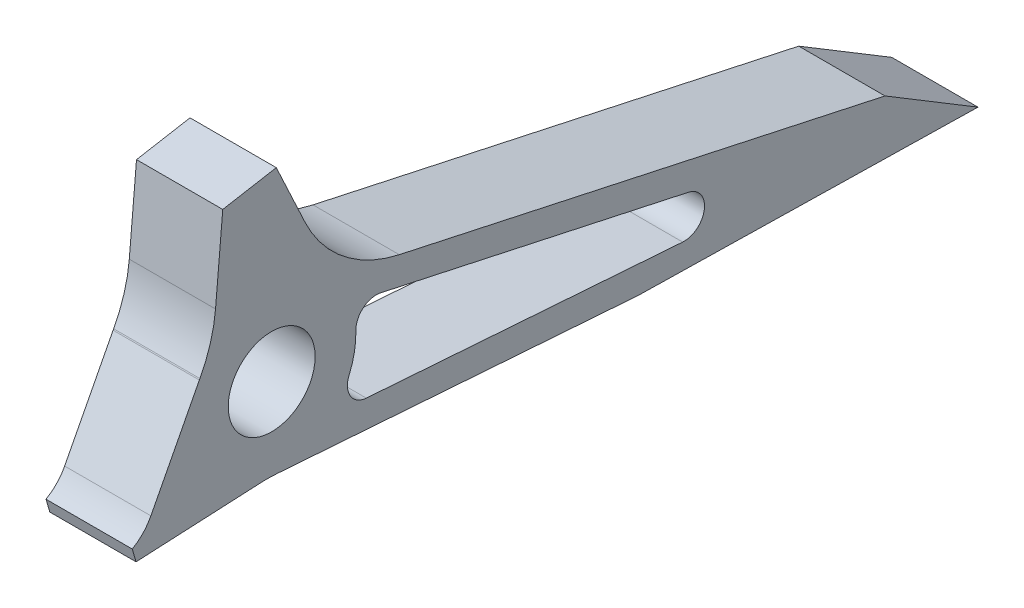
ISO-10303-21;
HEADER;
FILE_DESCRIPTION(('STEP AP214'),'2;1');
FILE_NAME('part.step','',(''),(''),'','','');
FILE_SCHEMA(('AUTOMOTIVE_DESIGN { 1 0 10303 214 1 1 1 1 }'));
ENDSEC;
DATA;
#1=APPLICATION_CONTEXT('core data for automotive mechanical design processes');
#2=APPLICATION_PROTOCOL_DEFINITION('international standard','automotive_design',2000,#1);
#3=PRODUCT_CONTEXT('',#1,'mechanical');
#4=PRODUCT('Part','Part','',(#3));
#5=PRODUCT_RELATED_PRODUCT_CATEGORY('part','',(#4));
#6=PRODUCT_DEFINITION_FORMATION('','',#4);
#7=PRODUCT_DEFINITION_CONTEXT('part definition',#1,'design');
#8=PRODUCT_DEFINITION('design','',#6,#7);
#9=PRODUCT_DEFINITION_SHAPE('','',#8);
#10=(LENGTH_UNIT() NAMED_UNIT(*) SI_UNIT(.MILLI.,.METRE.));
#11=(NAMED_UNIT(*) PLANE_ANGLE_UNIT() SI_UNIT($,.RADIAN.));
#12=(NAMED_UNIT(*) SI_UNIT($,.STERADIAN.) SOLID_ANGLE_UNIT());
#13=UNCERTAINTY_MEASURE_WITH_UNIT(LENGTH_MEASURE(1.E-05),#10,'distance_accuracy_value','');
#14=(GEOMETRIC_REPRESENTATION_CONTEXT(3) GLOBAL_UNCERTAINTY_ASSIGNED_CONTEXT((#13)) GLOBAL_UNIT_ASSIGNED_CONTEXT((#10,
#11,#12)) REPRESENTATION_CONTEXT('',''));
#15=CARTESIAN_POINT('',(0.,0.,0.));
#16=DIRECTION('',(0.,0.,1.));
#17=DIRECTION('',(1.,0.,0.));
#18=AXIS2_PLACEMENT_3D('',#15,#16,#17);
#19=CARTESIAN_POINT('',(62.2,8.5,-23.));
#20=DIRECTION('',(1.,0.,0.));
#21=DIRECTION('',(0.,0.,-1.));
#22=AXIS2_PLACEMENT_3D('',#19,#20,#21);
#23=PLANE('',#22);
#24=CARTESIAN_POINT('',(62.2,8.5,-23.));
#25=DIRECTION('',(1.,0.,0.));
#26=DIRECTION('',(0.,0.,-1.));
#27=AXIS2_PLACEMENT_3D('',#24,#25,#26);
#28=CIRCLE('',#27,6.);
#29=CARTESIAN_POINT('',(62.2,11.3386718122205,-17.7139861575565));
#30=VERTEX_POINT('',#29);
#31=CARTESIAN_POINT('',(62.2,11.2634582486114,-17.6742795315393));
#32=VERTEX_POINT('',#31);
#33=EDGE_CURVE('E243',#30,#32,#28,.T.);
#34=ORIENTED_EDGE('',*,*,#33,.T.);
#35=DIRECTION('',(0.,-0.887620078076786,0.460576374768573));
#36=VECTOR('',#35,1.);
#37=CARTESIAN_POINT('',(62.2,4.38798268831,-14.1066702732688));
#38=LINE('',#37,#36);
#39=CARTESIAN_POINT('',(62.2,4.38798268831,-14.1066702732688));
#40=VERTEX_POINT('',#39);
#41=EDGE_CURVE('E246',#32,#40,#38,.T.);
#42=ORIENTED_EDGE('',*,*,#41,.T.);
#43=CARTESIAN_POINT('',(62.2,6.,-11.));
#44=DIRECTION('',(-1.,0.,0.));
#45=DIRECTION('',(0.,0.,-1.));
#46=AXIS2_PLACEMENT_3D('',#43,#44,#45);
#47=CIRCLE('',#46,3.5);
#48=CARTESIAN_POINT('',(62.2,2.95997440656278,-12.7344291254608));
#49=VERTEX_POINT('',#48);
#50=EDGE_CURVE('E249',#40,#49,#47,.T.);
#51=ORIENTED_EDGE('',*,*,#50,.T.);
#52=DIRECTION('',(0.,-0.959974406562776,-0.280087734012836));
#53=VECTOR('',#52,1.);
#54=CARTESIAN_POINT('',(62.2,2.95997440656278,-12.7344291254608));
#55=LINE('',#54,#53);
#56=CARTESIAN_POINT('',(62.2,2.,-13.0145168594736));
#57=VERTEX_POINT('',#56);
#58=EDGE_CURVE('E251',#49,#57,#55,.T.);
#59=ORIENTED_EDGE('',*,*,#58,.T.);
#60=DIRECTION('',(0.,0.0492817376266249,-0.998784916954847));
#61=VECTOR('',#60,1.);
#62=CARTESIAN_POINT('',(62.2,2.,-13.0145168594736));
#63=LINE('',#62,#61);
#64=CARTESIAN_POINT('',(62.2,2.45245903245181,-22.1844300751292));
#65=VERTEX_POINT('',#64);
#66=EDGE_CURVE('E253',#57,#65,#63,.T.);
#67=ORIENTED_EDGE('',*,*,#66,.T.);
#68=CARTESIAN_POINT('',(62.2,-7.53539013709666,-22.6772474513954));
#69=DIRECTION('',(-1.,0.,0.));
#70=DIRECTION('',(0.,0.,1.));
#71=AXIS2_PLACEMENT_3D('',#68,#69,#70);
#72=CIRCLE('',#71,10.);
#73=CARTESIAN_POINT('',(62.2,2.43817170173702,-23.4039277435189));
#74=VERTEX_POINT('',#73);
#75=EDGE_CURVE('E255',#65,#74,#72,.T.);
#76=ORIENTED_EDGE('',*,*,#75,.T.);
#77=DIRECTION('',(0.,-0.0726680292123529,-0.997356183883367));
#78=VECTOR('',#77,1.);
#79=CARTESIAN_POINT('',(62.2,0.5,-50.0050005001));
#80=LINE('',#79,#78);
#81=CARTESIAN_POINT('',(62.2,0.5,-50.0050005001));
#82=VERTEX_POINT('',#81);
#83=EDGE_CURVE('E257',#74,#82,#80,.T.);
#84=ORIENTED_EDGE('',*,*,#83,.T.);
#85=DIRECTION('',(0.,-0.02,-0.999799979995999));
#86=VECTOR('',#85,1.);
#87=CARTESIAN_POINT('',(62.2,0.,-75.));
#88=LINE('',#87,#86);
#89=CARTESIAN_POINT('',(62.2,0.,-75.));
#90=VERTEX_POINT('',#89);
#91=EDGE_CURVE('E259',#82,#90,#88,.T.);
#92=ORIENTED_EDGE('',*,*,#91,.T.);
#93=DIRECTION('',(0.,0.51722049807369,0.855852181379708));
#94=VECTOR('',#93,1.);
#95=CARTESIAN_POINT('',(62.2,0.,-75.));
#96=LINE('',#95,#94);
#97=CARTESIAN_POINT('',(62.2,4.13776398458951,-68.1531825489624));
#98=VERTEX_POINT('',#97);
#99=EDGE_CURVE('E261',#90,#98,#96,.T.);
#100=ORIENTED_EDGE('',*,*,#99,.T.);
#101=DIRECTION('',(0.,0.212023103010523,0.977264653914071));
#102=VECTOR('',#101,1.);
#103=CARTESIAN_POINT('',(62.2,4.13776398458951,-68.1531825489624));
#104=LINE('',#103,#102);
#105=CARTESIAN_POINT('',(62.2,11.8961115001762,-32.3931229511709));
#106=VERTEX_POINT('',#105);
#107=EDGE_CURVE('E263',#98,#106,#104,.T.);
#108=ORIENTED_EDGE('',*,*,#107,.T.);
#109=CARTESIAN_POINT('',(62.2,21.668758039317,-34.5133539812761));
#110=DIRECTION('',(-1.,0.,0.));
#111=DIRECTION('',(0.,0.,-1.));
#112=AXIS2_PLACEMENT_3D('',#109,#110,#111);
#113=CIRCLE('',#112,10.);
#114=CARTESIAN_POINT('',(62.2,17.4425754219099,-25.4502761109097));
#115=VERTEX_POINT('',#114);
#116=EDGE_CURVE('E265',#106,#115,#113,.T.);
#117=ORIENTED_EDGE('',*,*,#116,.T.);
#118=DIRECTION('',(0.,0.906307787036648,0.422618261740704));
#119=VECTOR('',#118,1.);
#120=CARTESIAN_POINT('',(62.2,17.4425754219099,-25.4502761109097));
#121=LINE('',#120,#119);
#122=CARTESIAN_POINT('',(62.2,21.9741143570931,-23.3371848022062));
#123=VERTEX_POINT('',#122);
#124=EDGE_CURVE('E267',#115,#123,#121,.T.);
#125=ORIENTED_EDGE('',*,*,#124,.T.);
#126=DIRECTION('',(0.,-0.173648177666939,0.984807753012207));
#127=VECTOR('',#126,1.);
#128=CARTESIAN_POINT('',(62.2,21.9741143570931,-23.3371848022062));
#129=LINE('',#128,#127);
#130=CARTESIAN_POINT('',(62.2,21.2795216464254,-19.3979537901573));
#131=VERTEX_POINT('',#130);
#132=EDGE_CURVE('E269',#123,#131,#129,.T.);
#133=ORIENTED_EDGE('',*,*,#132,.T.);
#134=DIRECTION('',(0.,-0.996194698091746,0.0871557427476466));
#135=VECTOR('',#134,1.);
#136=CARTESIAN_POINT('',(62.2,21.2795216464254,-19.3979537901573));
#137=LINE('',#136,#135);
#138=CARTESIAN_POINT('',(62.2,15.1982340717782,-18.8659100677347));
#139=VERTEX_POINT('',#138);
#140=EDGE_CURVE('E271',#131,#139,#137,.T.);
#141=ORIENTED_EDGE('',*,*,#140,.T.);
#142=CARTESIAN_POINT('',(62.2,16.0697914992547,-8.90396308681724));
#143=DIRECTION('',(-1.,0.,0.));
#144=DIRECTION('',(0.,0.,-1.));
#145=AXIS2_PLACEMENT_3D('',#142,#143,#144);
#146=CIRCLE('',#145,10.);
#147=EDGE_CURVE('E273',#139,#30,#146,.T.);
#148=ORIENTED_EDGE('',*,*,#147,.T.);
#149=EDGE_LOOP('',(#34,#42,#51,#59,#67,#76,#84,#92,#100,#108,#117,#125,#133,#141,#148));
#150=FACE_BOUND('',#149,.T.);
#151=CARTESIAN_POINT('',(62.2,8.5,-23.));
#152=DIRECTION('',(1.,0.,0.));
#153=DIRECTION('',(0.,0.,-1.));
#154=AXIS2_PLACEMENT_3D('',#151,#152,#153);
#155=CIRCLE('',#154,3.2);
#156=CARTESIAN_POINT('',(62.2,8.5,-26.2));
#157=VERTEX_POINT('',#156);
#158=EDGE_CURVE('E237',#157,#157,#155,.T.);
#159=ORIENTED_EDGE('',*,*,#158,.F.);
#160=EDGE_LOOP('',(#159));
#161=FACE_BOUND('',#160,.T.);
#162=DIRECTION('',(0.,0.212023103010523,0.977264653914071));
#163=VECTOR('',#162,1.);
#164=CARTESIAN_POINT('',(62.2,5.23023519782503,-53.6847899136491));
#165=LINE('',#164,#163);
#166=CARTESIAN_POINT('',(62.2,5.23023519782503,-53.6847899136491));
#167=VERTEX_POINT('',#166);
#168=CARTESIAN_POINT('',(62.2,10.1483853874414,-31.0158718820407));
#169=VERTEX_POINT('',#168);
#170=EDGE_CURVE('E194',#167,#169,#165,.T.);
#171=ORIENTED_EDGE('',*,*,#170,.F.);
#172=CARTESIAN_POINT('',(62.2,3.76433821695393,-53.3667552591334));
#173=DIRECTION('',(1.,0.,0.));
#174=DIRECTION('',(0.,0.,-1.));
#175=AXIS2_PLACEMENT_3D('',#172,#173,#174);
#176=CIRCLE('',#175,1.5);
#177=CARTESIAN_POINT('',(62.2,2.26830394112888,-53.2577532153148));
#178=VERTEX_POINT('',#177);
#179=EDGE_CURVE('E186',#178,#167,#176,.T.);
#180=ORIENTED_EDGE('',*,*,#179,.F.);
#181=DIRECTION('',(0.,-0.0726680292123527,-0.997356183883367));
#182=VECTOR('',#181,1.);
#183=CARTESIAN_POINT('',(62.2,3.9653504490001,-29.9660822107663));
#184=LINE('',#183,#182);
#185=CARTESIAN_POINT('',(62.2,3.9653504490001,-29.9660822107663));
#186=VERTEX_POINT('',#185);
#187=EDGE_CURVE('E215',#186,#178,#184,.T.);
#188=ORIENTED_EDGE('',*,*,#187,.F.);
#189=CARTESIAN_POINT('',(62.2,5.46138472482515,-30.0750842545848));
#190=DIRECTION('',(1.,0.,0.));
#191=DIRECTION('',(0.,0.,-1.));
#192=AXIS2_PLACEMENT_3D('',#189,#190,#191);
#193=CIRCLE('',#192,1.5);
#194=CARTESIAN_POINT('',(62.2,6.05332276544363,-28.6968210881073));
#195=VERTEX_POINT('',#194);
#196=EDGE_CURVE('E213',#195,#186,#193,.T.);
#197=ORIENTED_EDGE('',*,*,#196,.F.);
#198=CARTESIAN_POINT('',(62.2,8.5,-23.));
#199=DIRECTION('',(-1.,0.,0.));
#200=DIRECTION('',(0.,0.,1.));
#201=AXIS2_PLACEMENT_3D('',#198,#199,#200);
#202=CIRCLE('',#201,6.2);
#203=CARTESIAN_POINT('',(62.2,8.64693871697864,-29.1982585468382));
#204=VERTEX_POINT('',#203);
#205=EDGE_CURVE('E209',#204,#195,#202,.T.);
#206=ORIENTED_EDGE('',*,*,#205,.F.);
#207=CARTESIAN_POINT('',(62.2,8.68248840657025,-30.6978372275249));
#208=DIRECTION('',(1.,0.,0.));
#209=DIRECTION('',(0.,0.,1.));
#210=AXIS2_PLACEMENT_3D('',#207,#208,#209);
#211=CIRCLE('',#210,1.5);
#212=EDGE_CURVE('E207',#169,#204,#211,.T.);
#213=ORIENTED_EDGE('',*,*,#212,.F.);
#214=EDGE_LOOP('',(#171,#180,#188,#197,#206,#213));
#215=FACE_BOUND('',#214,.T.);
#216=ADVANCED_FACE('F43',(#150,#161,#215),#23,.T.);
#217=CARTESIAN_POINT('',(55.85,8.5,-23.));
#218=DIRECTION('',(1.,0.,0.));
#219=DIRECTION('',(0.,0.,-1.));
#220=AXIS2_PLACEMENT_3D('',#217,#218,#219);
#221=PLANE('',#220);
#222=CARTESIAN_POINT('',(55.85,8.5,-23.));
#223=DIRECTION('',(1.,0.,0.));
#224=DIRECTION('',(0.,0.,-1.));
#225=AXIS2_PLACEMENT_3D('',#222,#223,#224);
#226=CIRCLE('',#225,3.2);
#227=CARTESIAN_POINT('',(55.85,8.5,-26.2));
#228=VERTEX_POINT('',#227);
#229=EDGE_CURVE('E202',#228,#228,#226,.T.);
#230=ORIENTED_EDGE('',*,*,#229,.T.);
#231=EDGE_LOOP('',(#230));
#232=FACE_BOUND('',#231,.T.);
#233=CARTESIAN_POINT('',(55.85,8.5,-23.));
#234=DIRECTION('',(1.,0.,0.));
#235=DIRECTION('',(0.,0.,-1.));
#236=AXIS2_PLACEMENT_3D('',#233,#234,#235);
#237=CIRCLE('',#236,6.);
#238=CARTESIAN_POINT('',(55.85,11.3386718122205,-17.7139861575565));
#239=VERTEX_POINT('',#238);
#240=CARTESIAN_POINT('',(55.85,11.2634582486114,-17.6742795315393));
#241=VERTEX_POINT('',#240);
#242=EDGE_CURVE('E240',#239,#241,#237,.T.);
#243=ORIENTED_EDGE('',*,*,#242,.F.);
#244=CARTESIAN_POINT('',(55.85,16.0697914992547,-8.90396308681724));
#245=DIRECTION('',(-1.,0.,0.));
#246=DIRECTION('',(0.,0.,-1.));
#247=AXIS2_PLACEMENT_3D('',#244,#245,#246);
#248=CIRCLE('',#247,10.);
#249=CARTESIAN_POINT('',(55.85,15.1982340717782,-18.8659100677347));
#250=VERTEX_POINT('',#249);
#251=EDGE_CURVE('E247',#250,#239,#248,.T.);
#252=ORIENTED_EDGE('',*,*,#251,.F.);
#253=DIRECTION('',(0.,-0.996194698091746,0.0871557427476466));
#254=VECTOR('',#253,1.);
#255=CARTESIAN_POINT('',(55.85,21.2795216464254,-19.3979537901573));
#256=LINE('',#255,#254);
#257=CARTESIAN_POINT('',(55.85,21.2795216464254,-19.3979537901573));
#258=VERTEX_POINT('',#257);
#259=EDGE_CURVE('E302',#258,#250,#256,.T.);
#260=ORIENTED_EDGE('',*,*,#259,.F.);
#261=DIRECTION('',(0.,-0.173648177666939,0.984807753012207));
#262=VECTOR('',#261,1.);
#263=CARTESIAN_POINT('',(55.85,21.9741143570931,-23.3371848022062));
#264=LINE('',#263,#262);
#265=CARTESIAN_POINT('',(55.85,21.9741143570931,-23.3371848022062));
#266=VERTEX_POINT('',#265);
#267=EDGE_CURVE('E300',#266,#258,#264,.T.);
#268=ORIENTED_EDGE('',*,*,#267,.F.);
#269=DIRECTION('',(0.,0.906307787036648,0.422618261740704));
#270=VECTOR('',#269,1.);
#271=CARTESIAN_POINT('',(55.85,17.4425754219099,-25.4502761109097));
#272=LINE('',#271,#270);
#273=CARTESIAN_POINT('',(55.85,17.4425754219099,-25.4502761109097));
#274=VERTEX_POINT('',#273);
#275=EDGE_CURVE('E298',#274,#266,#272,.T.);
#276=ORIENTED_EDGE('',*,*,#275,.F.);
#277=CARTESIAN_POINT('',(55.85,21.668758039317,-34.5133539812761));
#278=DIRECTION('',(-1.,0.,0.));
#279=DIRECTION('',(0.,0.,-1.));
#280=AXIS2_PLACEMENT_3D('',#277,#278,#279);
#281=CIRCLE('',#280,10.);
#282=CARTESIAN_POINT('',(55.85,11.8961115001762,-32.3931229511709));
#283=VERTEX_POINT('',#282);
#284=EDGE_CURVE('E296',#283,#274,#281,.T.);
#285=ORIENTED_EDGE('',*,*,#284,.F.);
#286=DIRECTION('',(0.,0.212023103010523,0.977264653914071));
#287=VECTOR('',#286,1.);
#288=CARTESIAN_POINT('',(55.85,4.13776398458951,-68.1531825489624));
#289=LINE('',#288,#287);
#290=CARTESIAN_POINT('',(55.85,4.13776398458951,-68.1531825489624));
#291=VERTEX_POINT('',#290);
#292=EDGE_CURVE('E294',#291,#283,#289,.T.);
#293=ORIENTED_EDGE('',*,*,#292,.F.);
#294=DIRECTION('',(0.,0.51722049807369,0.855852181379708));
#295=VECTOR('',#294,1.);
#296=CARTESIAN_POINT('',(55.85,0.,-75.));
#297=LINE('',#296,#295);
#298=CARTESIAN_POINT('',(55.85,0.,-75.));
#299=VERTEX_POINT('',#298);
#300=EDGE_CURVE('E292',#299,#291,#297,.T.);
#301=ORIENTED_EDGE('',*,*,#300,.F.);
#302=DIRECTION('',(0.,-0.02,-0.999799979995999));
#303=VECTOR('',#302,1.);
#304=CARTESIAN_POINT('',(55.85,0.,-75.));
#305=LINE('',#304,#303);
#306=CARTESIAN_POINT('',(55.85,0.5,-50.0050005001));
#307=VERTEX_POINT('',#306);
#308=EDGE_CURVE('E290',#307,#299,#305,.T.);
#309=ORIENTED_EDGE('',*,*,#308,.F.);
#310=DIRECTION('',(0.,-0.0726680292123529,-0.997356183883367));
#311=VECTOR('',#310,1.);
#312=CARTESIAN_POINT('',(55.85,0.5,-50.0050005001));
#313=LINE('',#312,#311);
#314=CARTESIAN_POINT('',(55.85,2.43817170173702,-23.4039277435189));
#315=VERTEX_POINT('',#314);
#316=EDGE_CURVE('E288',#315,#307,#313,.T.);
#317=ORIENTED_EDGE('',*,*,#316,.F.);
#318=CARTESIAN_POINT('',(55.85,-7.53539013709666,-22.6772474513954));
#319=DIRECTION('',(-1.,0.,0.));
#320=DIRECTION('',(0.,0.,1.));
#321=AXIS2_PLACEMENT_3D('',#318,#319,#320);
#322=CIRCLE('',#321,10.);
#323=CARTESIAN_POINT('',(55.85,2.45245903245181,-22.1844300751292));
#324=VERTEX_POINT('',#323);
#325=EDGE_CURVE('E286',#324,#315,#322,.T.);
#326=ORIENTED_EDGE('',*,*,#325,.F.);
#327=DIRECTION('',(0.,0.0492817376266249,-0.998784916954847));
#328=VECTOR('',#327,1.);
#329=CARTESIAN_POINT('',(55.85,2.,-13.0145168594736));
#330=LINE('',#329,#328);
#331=CARTESIAN_POINT('',(55.85,2.,-13.0145168594736));
#332=VERTEX_POINT('',#331);
#333=EDGE_CURVE('E284',#332,#324,#330,.T.);
#334=ORIENTED_EDGE('',*,*,#333,.F.);
#335=DIRECTION('',(0.,-0.959974406562776,-0.280087734012836));
#336=VECTOR('',#335,1.);
#337=CARTESIAN_POINT('',(55.85,2.95997440656278,-12.7344291254608));
#338=LINE('',#337,#336);
#339=CARTESIAN_POINT('',(55.85,2.95997440656278,-12.7344291254608));
#340=VERTEX_POINT('',#339);
#341=EDGE_CURVE('E282',#340,#332,#338,.T.);
#342=ORIENTED_EDGE('',*,*,#341,.F.);
#343=CARTESIAN_POINT('',(55.85,6.,-11.));
#344=DIRECTION('',(-1.,0.,0.));
#345=DIRECTION('',(0.,0.,-1.));
#346=AXIS2_PLACEMENT_3D('',#343,#344,#345);
#347=CIRCLE('',#346,3.5);
#348=CARTESIAN_POINT('',(55.85,4.38798268831,-14.1066702732688));
#349=VERTEX_POINT('',#348);
#350=EDGE_CURVE('E280',#349,#340,#347,.T.);
#351=ORIENTED_EDGE('',*,*,#350,.F.);
#352=DIRECTION('',(0.,-0.887620078076786,0.460576374768573));
#353=VECTOR('',#352,1.);
#354=CARTESIAN_POINT('',(55.85,4.38798268831,-14.1066702732688));
#355=LINE('',#354,#353);
#356=EDGE_CURVE('E278',#241,#349,#355,.T.);
#357=ORIENTED_EDGE('',*,*,#356,.F.);
#358=EDGE_LOOP('',(#243,#252,#260,#268,#276,#285,#293,#301,#309,#317,#326,#334,#342,#351,#357));
#359=FACE_BOUND('',#358,.T.);
#360=CARTESIAN_POINT('',(55.85,3.76433821695393,-53.3667552591334));
#361=DIRECTION('',(1.,0.,0.));
#362=DIRECTION('',(0.,0.,-1.));
#363=AXIS2_PLACEMENT_3D('',#360,#361,#362);
#364=CIRCLE('',#363,1.5);
#365=CARTESIAN_POINT('',(55.85,2.26830394112888,-53.2577532153148));
#366=VERTEX_POINT('',#365);
#367=CARTESIAN_POINT('',(55.85,5.23023519782503,-53.6847899136491));
#368=VERTEX_POINT('',#367);
#369=EDGE_CURVE('E66',#366,#368,#364,.T.);
#370=ORIENTED_EDGE('',*,*,#369,.T.);
#371=DIRECTION('',(0.,0.212023103010523,0.977264653914071));
#372=VECTOR('',#371,1.);
#373=CARTESIAN_POINT('',(55.85,5.23023519782503,-53.6847899136491));
#374=LINE('',#373,#372);
#375=CARTESIAN_POINT('',(55.85,10.1483853874414,-31.0158718820407));
#376=VERTEX_POINT('',#375);
#377=EDGE_CURVE('E201',#368,#376,#374,.T.);
#378=ORIENTED_EDGE('',*,*,#377,.T.);
#379=CARTESIAN_POINT('',(55.85,8.68248840657025,-30.6978372275249));
#380=DIRECTION('',(1.,0.,0.));
#381=DIRECTION('',(0.,0.,1.));
#382=AXIS2_PLACEMENT_3D('',#379,#380,#381);
#383=CIRCLE('',#382,1.5);
#384=CARTESIAN_POINT('',(55.85,8.64693871697864,-29.1982585468382));
#385=VERTEX_POINT('',#384);
#386=EDGE_CURVE('E219',#376,#385,#383,.T.);
#387=ORIENTED_EDGE('',*,*,#386,.T.);
#388=CARTESIAN_POINT('',(55.85,8.5,-23.));
#389=DIRECTION('',(-1.,0.,0.));
#390=DIRECTION('',(0.,0.,1.));
#391=AXIS2_PLACEMENT_3D('',#388,#389,#390);
#392=CIRCLE('',#391,6.2);
#393=CARTESIAN_POINT('',(55.85,6.05332276544363,-28.6968210881073));
#394=VERTEX_POINT('',#393);
#395=EDGE_CURVE('E222',#385,#394,#392,.T.);
#396=ORIENTED_EDGE('',*,*,#395,.T.);
#397=CARTESIAN_POINT('',(55.85,5.46138472482515,-30.0750842545848));
#398=DIRECTION('',(1.,0.,0.));
#399=DIRECTION('',(0.,0.,-1.));
#400=AXIS2_PLACEMENT_3D('',#397,#398,#399);
#401=CIRCLE('',#400,1.5);
#402=CARTESIAN_POINT('',(55.85,3.9653504490001,-29.9660822107663));
#403=VERTEX_POINT('',#402);
#404=EDGE_CURVE('E225',#394,#403,#401,.T.);
#405=ORIENTED_EDGE('',*,*,#404,.T.);
#406=DIRECTION('',(0.,-0.0726680292123527,-0.997356183883367));
#407=VECTOR('',#406,1.);
#408=CARTESIAN_POINT('',(55.85,3.9653504490001,-29.9660822107663));
#409=LINE('',#408,#407);
#410=EDGE_CURVE('E195',#403,#366,#409,.T.);
#411=ORIENTED_EDGE('',*,*,#410,.T.);
#412=EDGE_LOOP('',(#370,#378,#387,#396,#405,#411));
#413=FACE_BOUND('',#412,.T.);
#414=ADVANCED_FACE('F353',(#232,#359,#413),#221,.F.);
#415=CARTESIAN_POINT('',(62.2,8.5,-23.));
#416=DIRECTION('',(-1.,0.,0.));
#417=DIRECTION('',(0.,0.,1.));
#418=AXIS2_PLACEMENT_3D('',#415,#416,#417);
#419=CYLINDRICAL_SURFACE('',#418,6.);
#420=ORIENTED_EDGE('',*,*,#242,.T.);
#421=DIRECTION('',(-1.,0.,0.));
#422=VECTOR('',#421,1.);
#423=CARTESIAN_POINT('',(62.2,11.2634582486114,-17.6742795315393));
#424=LINE('',#423,#422);
#425=EDGE_CURVE('E11',#32,#241,#424,.T.);
#426=ORIENTED_EDGE('',*,*,#425,.F.);
#427=ORIENTED_EDGE('',*,*,#33,.F.);
#428=DIRECTION('',(-1.,0.,0.));
#429=VECTOR('',#428,1.);
#430=CARTESIAN_POINT('',(62.2,11.3386718122205,-17.7139861575565));
#431=LINE('',#430,#429);
#432=EDGE_CURVE('E275',#30,#239,#431,.T.);
#433=ORIENTED_EDGE('',*,*,#432,.T.);
#434=EDGE_LOOP('',(#420,#426,#427,#433));
#435=FACE_BOUND('',#434,.T.);
#436=ADVANCED_FACE('F45',(#435),#419,.T.);
#437=CARTESIAN_POINT('',(62.2,4.38798268831,-14.1066702732688));
#438=DIRECTION('',(0.,-0.460576374768573,-0.887620078076786));
#439=DIRECTION('',(0.,0.887620078076786,-0.460576374768573));
#440=AXIS2_PLACEMENT_3D('',#437,#438,#439);
#441=PLANE('',#440);
#442=ORIENTED_EDGE('',*,*,#356,.T.);
#443=DIRECTION('',(-1.,0.,0.));
#444=VECTOR('',#443,1.);
#445=CARTESIAN_POINT('',(62.2,4.38798268831,-14.1066702732688));
#446=LINE('',#445,#444);
#447=EDGE_CURVE('E51',#40,#349,#446,.T.);
#448=ORIENTED_EDGE('',*,*,#447,.F.);
#449=ORIENTED_EDGE('',*,*,#41,.F.);
#450=ORIENTED_EDGE('',*,*,#425,.T.);
#451=EDGE_LOOP('',(#442,#448,#449,#450));
#452=FACE_BOUND('',#451,.T.);
#453=ADVANCED_FACE('F371',(#452),#441,.F.);
#454=CARTESIAN_POINT('',(62.2,6.,-11.));
#455=DIRECTION('',(-1.,0.,0.));
#456=DIRECTION('',(0.,0.,1.));
#457=AXIS2_PLACEMENT_3D('',#454,#455,#456);
#458=CYLINDRICAL_SURFACE('',#457,3.5);
#459=ORIENTED_EDGE('',*,*,#350,.T.);
#460=DIRECTION('',(-1.,0.,0.));
#461=VECTOR('',#460,1.);
#462=CARTESIAN_POINT('',(62.2,2.95997440656278,-12.7344291254608));
#463=LINE('',#462,#461);
#464=EDGE_CURVE('E340',#49,#340,#463,.T.);
#465=ORIENTED_EDGE('',*,*,#464,.F.);
#466=ORIENTED_EDGE('',*,*,#50,.F.);
#467=ORIENTED_EDGE('',*,*,#447,.T.);
#468=EDGE_LOOP('',(#459,#465,#466,#467));
#469=FACE_BOUND('',#468,.T.);
#470=ADVANCED_FACE('F347',(#469),#458,.F.);
#471=CARTESIAN_POINT('',(62.2,2.95997440656278,-12.7344291254608));
#472=DIRECTION('',(0.,0.280087734012836,-0.959974406562776));
#473=DIRECTION('',(0.,0.959974406562776,0.280087734012836));
#474=AXIS2_PLACEMENT_3D('',#471,#472,#473);
#475=PLANE('',#474);
#476=ORIENTED_EDGE('',*,*,#341,.T.);
#477=DIRECTION('',(-1.,0.,0.));
#478=VECTOR('',#477,1.);
#479=CARTESIAN_POINT('',(62.2,2.,-13.0145168594736));
#480=LINE('',#479,#478);
#481=EDGE_CURVE('E337',#57,#332,#480,.T.);
#482=ORIENTED_EDGE('',*,*,#481,.F.);
#483=ORIENTED_EDGE('',*,*,#58,.F.);
#484=ORIENTED_EDGE('',*,*,#464,.T.);
#485=EDGE_LOOP('',(#476,#482,#483,#484));
#486=FACE_BOUND('',#485,.T.);
#487=ADVANCED_FACE('F359',(#486),#475,.F.);
#488=CARTESIAN_POINT('',(62.2,2.,-13.0145168594736));
#489=DIRECTION('',(0.,0.998784916954847,0.0492817376266249));
#490=DIRECTION('',(0.,-0.0492817376266249,0.998784916954847));
#491=AXIS2_PLACEMENT_3D('',#488,#489,#490);
#492=PLANE('',#491);
#493=ORIENTED_EDGE('',*,*,#333,.T.);
#494=DIRECTION('',(-1.,0.,0.));
#495=VECTOR('',#494,1.);
#496=CARTESIAN_POINT('',(62.2,2.45245903245181,-22.1844300751292));
#497=LINE('',#496,#495);
#498=EDGE_CURVE('E334',#65,#324,#497,.T.);
#499=ORIENTED_EDGE('',*,*,#498,.F.);
#500=ORIENTED_EDGE('',*,*,#66,.F.);
#501=ORIENTED_EDGE('',*,*,#481,.T.);
#502=EDGE_LOOP('',(#493,#499,#500,#501));
#503=FACE_BOUND('',#502,.T.);
#504=ADVANCED_FACE('F363',(#503),#492,.F.);
#505=CARTESIAN_POINT('',(62.2,-7.53539013709666,-22.6772474513954));
#506=DIRECTION('',(-1.,0.,0.));
#507=DIRECTION('',(0.,0.,1.));
#508=AXIS2_PLACEMENT_3D('',#505,#506,#507);
#509=CYLINDRICAL_SURFACE('',#508,10.);
#510=ORIENTED_EDGE('',*,*,#325,.T.);
#511=DIRECTION('',(-1.,0.,0.));
#512=VECTOR('',#511,1.);
#513=CARTESIAN_POINT('',(62.2,2.43817170173702,-23.4039277435189));
#514=LINE('',#513,#512);
#515=EDGE_CURVE('E331',#74,#315,#514,.T.);
#516=ORIENTED_EDGE('',*,*,#515,.F.);
#517=ORIENTED_EDGE('',*,*,#75,.F.);
#518=ORIENTED_EDGE('',*,*,#498,.T.);
#519=EDGE_LOOP('',(#510,#516,#517,#518));
#520=FACE_BOUND('',#519,.T.);
#521=ADVANCED_FACE('F419',(#520),#509,.F.);
#522=CARTESIAN_POINT('',(62.2,0.5,-50.0050005001));
#523=DIRECTION('',(0.,0.997356183883367,-0.0726680292123529));
#524=DIRECTION('',(0.,0.0726680292123529,0.997356183883367));
#525=AXIS2_PLACEMENT_3D('',#522,#523,#524);
#526=PLANE('',#525);
#527=ORIENTED_EDGE('',*,*,#316,.T.);
#528=DIRECTION('',(-1.,0.,0.));
#529=VECTOR('',#528,1.);
#530=CARTESIAN_POINT('',(62.2,0.5,-50.0050005001));
#531=LINE('',#530,#529);
#532=EDGE_CURVE('E328',#82,#307,#531,.T.);
#533=ORIENTED_EDGE('',*,*,#532,.F.);
#534=ORIENTED_EDGE('',*,*,#83,.F.);
#535=ORIENTED_EDGE('',*,*,#515,.T.);
#536=EDGE_LOOP('',(#527,#533,#534,#535));
#537=FACE_BOUND('',#536,.T.);
#538=ADVANCED_FACE('F417',(#537),#526,.F.);
#539=CARTESIAN_POINT('',(62.2,0.,-75.));
#540=DIRECTION('',(0.,0.999799979995999,-0.02));
#541=DIRECTION('',(0.,0.02,0.999799979995999));
#542=AXIS2_PLACEMENT_3D('',#539,#540,#541);
#543=PLANE('',#542);
#544=ORIENTED_EDGE('',*,*,#308,.T.);
#545=DIRECTION('',(-1.,0.,0.));
#546=VECTOR('',#545,1.);
#547=CARTESIAN_POINT('',(62.2,0.,-75.));
#548=LINE('',#547,#546);
#549=EDGE_CURVE('E325',#90,#299,#548,.T.);
#550=ORIENTED_EDGE('',*,*,#549,.F.);
#551=ORIENTED_EDGE('',*,*,#91,.F.);
#552=ORIENTED_EDGE('',*,*,#532,.T.);
#553=EDGE_LOOP('',(#544,#550,#551,#552));
#554=FACE_BOUND('',#553,.T.);
#555=ADVANCED_FACE('F413',(#554),#543,.F.);
#556=CARTESIAN_POINT('',(62.2,0.,-75.));
#557=DIRECTION('',(0.,-0.855852181379708,0.51722049807369));
#558=DIRECTION('',(0.,-0.51722049807369,-0.855852181379708));
#559=AXIS2_PLACEMENT_3D('',#556,#557,#558);
#560=PLANE('',#559);
#561=ORIENTED_EDGE('',*,*,#300,.T.);
#562=DIRECTION('',(-1.,0.,0.));
#563=VECTOR('',#562,1.);
#564=CARTESIAN_POINT('',(62.2,4.13776398458951,-68.1531825489624));
#565=LINE('',#564,#563);
#566=EDGE_CURVE('E322',#98,#291,#565,.T.);
#567=ORIENTED_EDGE('',*,*,#566,.F.);
#568=ORIENTED_EDGE('',*,*,#99,.F.);
#569=ORIENTED_EDGE('',*,*,#549,.T.);
#570=EDGE_LOOP('',(#561,#567,#568,#569));
#571=FACE_BOUND('',#570,.T.);
#572=ADVANCED_FACE('F408',(#571),#560,.F.);
#573=CARTESIAN_POINT('',(62.2,4.13776398458951,-68.1531825489624));
#574=DIRECTION('',(0.,-0.977264653914071,0.212023103010523));
#575=DIRECTION('',(0.,-0.212023103010523,-0.977264653914071));
#576=AXIS2_PLACEMENT_3D('',#573,#574,#575);
#577=PLANE('',#576);
#578=ORIENTED_EDGE('',*,*,#292,.T.);
#579=DIRECTION('',(-1.,0.,0.));
#580=VECTOR('',#579,1.);
#581=CARTESIAN_POINT('',(62.2,11.8961115001762,-32.3931229511709));
#582=LINE('',#581,#580);
#583=EDGE_CURVE('E319',#106,#283,#582,.T.);
#584=ORIENTED_EDGE('',*,*,#583,.F.);
#585=ORIENTED_EDGE('',*,*,#107,.F.);
#586=ORIENTED_EDGE('',*,*,#566,.T.);
#587=EDGE_LOOP('',(#578,#584,#585,#586));
#588=FACE_BOUND('',#587,.T.);
#589=ADVANCED_FACE('F402',(#588),#577,.F.);
#590=CARTESIAN_POINT('',(62.2,21.668758039317,-34.5133539812761));
#591=DIRECTION('',(-1.,0.,0.));
#592=DIRECTION('',(0.,0.,1.));
#593=AXIS2_PLACEMENT_3D('',#590,#591,#592);
#594=CYLINDRICAL_SURFACE('',#593,10.);
#595=ORIENTED_EDGE('',*,*,#284,.T.);
#596=DIRECTION('',(-1.,0.,0.));
#597=VECTOR('',#596,1.);
#598=CARTESIAN_POINT('',(62.2,17.4425754219099,-25.4502761109097));
#599=LINE('',#598,#597);
#600=EDGE_CURVE('E316',#115,#274,#599,.T.);
#601=ORIENTED_EDGE('',*,*,#600,.F.);
#602=ORIENTED_EDGE('',*,*,#116,.F.);
#603=ORIENTED_EDGE('',*,*,#583,.T.);
#604=EDGE_LOOP('',(#595,#601,#602,#603));
#605=FACE_BOUND('',#604,.T.);
#606=ADVANCED_FACE('F398',(#605),#594,.F.);
#607=CARTESIAN_POINT('',(62.2,17.4425754219099,-25.4502761109097));
#608=DIRECTION('',(0.,-0.422618261740704,0.906307787036648));
#609=DIRECTION('',(0.,-0.906307787036648,-0.422618261740704));
#610=AXIS2_PLACEMENT_3D('',#607,#608,#609);
#611=PLANE('',#610);
#612=ORIENTED_EDGE('',*,*,#275,.T.);
#613=DIRECTION('',(-1.,0.,0.));
#614=VECTOR('',#613,1.);
#615=CARTESIAN_POINT('',(62.2,21.9741143570931,-23.3371848022062));
#616=LINE('',#615,#614);
#617=EDGE_CURVE('E313',#123,#266,#616,.T.);
#618=ORIENTED_EDGE('',*,*,#617,.F.);
#619=ORIENTED_EDGE('',*,*,#124,.F.);
#620=ORIENTED_EDGE('',*,*,#600,.T.);
#621=EDGE_LOOP('',(#612,#618,#619,#620));
#622=FACE_BOUND('',#621,.T.);
#623=ADVANCED_FACE('F393',(#622),#611,.F.);
#624=CARTESIAN_POINT('',(62.2,21.9741143570931,-23.3371848022062));
#625=DIRECTION('',(0.,-0.984807753012206,-0.173648177666939));
#626=DIRECTION('',(0.,0.173648177666939,-0.984807753012207));
#627=AXIS2_PLACEMENT_3D('',#624,#625,#626);
#628=PLANE('',#627);
#629=ORIENTED_EDGE('',*,*,#267,.T.);
#630=DIRECTION('',(-1.,0.,0.));
#631=VECTOR('',#630,1.);
#632=CARTESIAN_POINT('',(62.2,21.2795216464254,-19.3979537901573));
#633=LINE('',#632,#631);
#634=EDGE_CURVE('E310',#131,#258,#633,.T.);
#635=ORIENTED_EDGE('',*,*,#634,.F.);
#636=ORIENTED_EDGE('',*,*,#132,.F.);
#637=ORIENTED_EDGE('',*,*,#617,.T.);
#638=EDGE_LOOP('',(#629,#635,#636,#637));
#639=FACE_BOUND('',#638,.T.);
#640=ADVANCED_FACE('F387',(#639),#628,.F.);
#641=CARTESIAN_POINT('',(62.2,21.2795216464254,-19.3979537901573));
#642=DIRECTION('',(0.,-0.0871557427476466,-0.996194698091747));
#643=DIRECTION('',(0.,0.996194698091747,-0.0871557427476466));
#644=AXIS2_PLACEMENT_3D('',#641,#642,#643);
#645=PLANE('',#644);
#646=ORIENTED_EDGE('',*,*,#259,.T.);
#647=DIRECTION('',(-1.,0.,0.));
#648=VECTOR('',#647,1.);
#649=CARTESIAN_POINT('',(62.2,15.1982340717782,-18.8659100677347));
#650=LINE('',#649,#648);
#651=EDGE_CURVE('E307',#139,#250,#650,.T.);
#652=ORIENTED_EDGE('',*,*,#651,.F.);
#653=ORIENTED_EDGE('',*,*,#140,.F.);
#654=ORIENTED_EDGE('',*,*,#634,.T.);
#655=EDGE_LOOP('',(#646,#652,#653,#654));
#656=FACE_BOUND('',#655,.T.);
#657=ADVANCED_FACE('F383',(#656),#645,.F.);
#658=CARTESIAN_POINT('',(62.2,16.0697914992547,-8.90396308681724));
#659=DIRECTION('',(-1.,0.,0.));
#660=DIRECTION('',(0.,0.,1.));
#661=AXIS2_PLACEMENT_3D('',#658,#659,#660);
#662=CYLINDRICAL_SURFACE('',#661,10.);
#663=ORIENTED_EDGE('',*,*,#251,.T.);
#664=ORIENTED_EDGE('',*,*,#432,.F.);
#665=ORIENTED_EDGE('',*,*,#147,.F.);
#666=ORIENTED_EDGE('',*,*,#651,.T.);
#667=EDGE_LOOP('',(#663,#664,#665,#666));
#668=FACE_BOUND('',#667,.T.);
#669=ADVANCED_FACE('F378',(#668),#662,.F.);
#670=CARTESIAN_POINT('',(62.2,8.5,-23.));
#671=DIRECTION('',(-1.,0.,0.));
#672=DIRECTION('',(0.,0.,1.));
#673=AXIS2_PLACEMENT_3D('',#670,#671,#672);
#674=CYLINDRICAL_SURFACE('',#673,3.2);
#675=ORIENTED_EDGE('',*,*,#158,.T.);
#676=EDGE_LOOP('',(#675));
#677=FACE_BOUND('',#676,.T.);
#678=ORIENTED_EDGE('',*,*,#229,.F.);
#679=EDGE_LOOP('',(#678));
#680=FACE_BOUND('',#679,.T.);
#681=ADVANCED_FACE('F438',(#677,#680),#674,.F.);
#682=CARTESIAN_POINT('',(62.2,3.76433821695393,-53.3667552591334));
#683=DIRECTION('',(-1.,0.,0.));
#684=DIRECTION('',(0.,0.,1.));
#685=AXIS2_PLACEMENT_3D('',#682,#683,#684);
#686=CYLINDRICAL_SURFACE('',#685,1.5);
#687=ORIENTED_EDGE('',*,*,#369,.F.);
#688=DIRECTION('',(-1.,0.,0.));
#689=VECTOR('',#688,1.);
#690=CARTESIAN_POINT('',(62.2,2.26830394112888,-53.2577532153148));
#691=LINE('',#690,#689);
#692=EDGE_CURVE('E190',#178,#366,#691,.T.);
#693=ORIENTED_EDGE('',*,*,#692,.F.);
#694=ORIENTED_EDGE('',*,*,#179,.T.);
#695=DIRECTION('',(-1.,0.,0.));
#696=VECTOR('',#695,1.);
#697=CARTESIAN_POINT('',(62.2,5.23023519782503,-53.6847899136491));
#698=LINE('',#697,#696);
#699=EDGE_CURVE('E189',#167,#368,#698,.T.);
#700=ORIENTED_EDGE('',*,*,#699,.T.);
#701=EDGE_LOOP('',(#687,#693,#694,#700));
#702=FACE_BOUND('',#701,.T.);
#703=ADVANCED_FACE('F188',(#702),#686,.F.);
#704=CARTESIAN_POINT('',(62.2,5.23023519782503,-53.6847899136491));
#705=DIRECTION('',(0.,-0.977264653914071,0.212023103010523));
#706=DIRECTION('',(0.,-0.212023103010523,-0.977264653914071));
#707=AXIS2_PLACEMENT_3D('',#704,#705,#706);
#708=PLANE('',#707);
#709=ORIENTED_EDGE('',*,*,#377,.F.);
#710=ORIENTED_EDGE('',*,*,#699,.F.);
#711=ORIENTED_EDGE('',*,*,#170,.T.);
#712=DIRECTION('',(-1.,0.,0.));
#713=VECTOR('',#712,1.);
#714=CARTESIAN_POINT('',(62.2,10.1483853874414,-31.0158718820407));
#715=LINE('',#714,#713);
#716=EDGE_CURVE('E203',#169,#376,#715,.T.);
#717=ORIENTED_EDGE('',*,*,#716,.T.);
#718=EDGE_LOOP('',(#709,#710,#711,#717));
#719=FACE_BOUND('',#718,.T.);
#720=ADVANCED_FACE('F198',(#719),#708,.T.);
#721=CARTESIAN_POINT('',(62.2,8.68248840657025,-30.6978372275249));
#722=DIRECTION('',(-1.,0.,0.));
#723=DIRECTION('',(0.,0.,1.));
#724=AXIS2_PLACEMENT_3D('',#721,#722,#723);
#725=CYLINDRICAL_SURFACE('',#724,1.5);
#726=ORIENTED_EDGE('',*,*,#386,.F.);
#727=ORIENTED_EDGE('',*,*,#716,.F.);
#728=ORIENTED_EDGE('',*,*,#212,.T.);
#729=DIRECTION('',(-1.,0.,0.));
#730=VECTOR('',#729,1.);
#731=CARTESIAN_POINT('',(62.2,8.64693871697864,-29.1982585468382));
#732=LINE('',#731,#730);
#733=EDGE_CURVE('E234',#204,#385,#732,.T.);
#734=ORIENTED_EDGE('',*,*,#733,.T.);
#735=EDGE_LOOP('',(#726,#727,#728,#734));
#736=FACE_BOUND('',#735,.T.);
#737=ADVANCED_FACE('F518',(#736),#725,.F.);
#738=CARTESIAN_POINT('',(62.2,8.5,-23.));
#739=DIRECTION('',(-1.,0.,0.));
#740=DIRECTION('',(0.,0.,1.));
#741=AXIS2_PLACEMENT_3D('',#738,#739,#740);
#742=CYLINDRICAL_SURFACE('',#741,6.2);
#743=ORIENTED_EDGE('',*,*,#395,.F.);
#744=ORIENTED_EDGE('',*,*,#733,.F.);
#745=ORIENTED_EDGE('',*,*,#205,.T.);
#746=DIRECTION('',(-1.,0.,0.));
#747=VECTOR('',#746,1.);
#748=CARTESIAN_POINT('',(62.2,6.05332276544363,-28.6968210881073));
#749=LINE('',#748,#747);
#750=EDGE_CURVE('E232',#195,#394,#749,.T.);
#751=ORIENTED_EDGE('',*,*,#750,.T.);
#752=EDGE_LOOP('',(#743,#744,#745,#751));
#753=FACE_BOUND('',#752,.T.);
#754=ADVANCED_FACE('F526',(#753),#742,.T.);
#755=CARTESIAN_POINT('',(62.2,5.46138472482515,-30.0750842545848));
#756=DIRECTION('',(-1.,0.,0.));
#757=DIRECTION('',(0.,0.,1.));
#758=AXIS2_PLACEMENT_3D('',#755,#756,#757);
#759=CYLINDRICAL_SURFACE('',#758,1.5);
#760=ORIENTED_EDGE('',*,*,#404,.F.);
#761=ORIENTED_EDGE('',*,*,#750,.F.);
#762=ORIENTED_EDGE('',*,*,#196,.T.);
#763=DIRECTION('',(-1.,0.,0.));
#764=VECTOR('',#763,1.);
#765=CARTESIAN_POINT('',(62.2,3.9653504490001,-29.9660822107663));
#766=LINE('',#765,#764);
#767=EDGE_CURVE('E58',#186,#403,#766,.T.);
#768=ORIENTED_EDGE('',*,*,#767,.T.);
#769=EDGE_LOOP('',(#760,#761,#762,#768));
#770=FACE_BOUND('',#769,.T.);
#771=ADVANCED_FACE('F535',(#770),#759,.F.);
#772=CARTESIAN_POINT('',(62.2,3.9653504490001,-29.9660822107663));
#773=DIRECTION('',(0.,0.997356183883367,-0.0726680292123527));
#774=DIRECTION('',(0.,0.0726680292123527,0.997356183883367));
#775=AXIS2_PLACEMENT_3D('',#772,#773,#774);
#776=PLANE('',#775);
#777=ORIENTED_EDGE('',*,*,#410,.F.);
#778=ORIENTED_EDGE('',*,*,#767,.F.);
#779=ORIENTED_EDGE('',*,*,#187,.T.);
#780=ORIENTED_EDGE('',*,*,#692,.T.);
#781=EDGE_LOOP('',(#777,#778,#779,#780));
#782=FACE_BOUND('',#781,.T.);
#783=ADVANCED_FACE('F544',(#782),#776,.T.);
#784=CLOSED_SHELL('',(#216,#414,#436,#453,#470,#487,#504,#521,#538,#555,#572,#589,#606,#623,
#640,#657,#669,#681,#703,#720,#737,#754,#771,#783));
#785=MANIFOLD_SOLID_BREP('B2',#784);
#786=ADVANCED_BREP_SHAPE_REPRESENTATION('',(#18,#785),#14);
#787=SHAPE_DEFINITION_REPRESENTATION(#9,#786);
ENDSEC;
END-ISO-10303-21;
